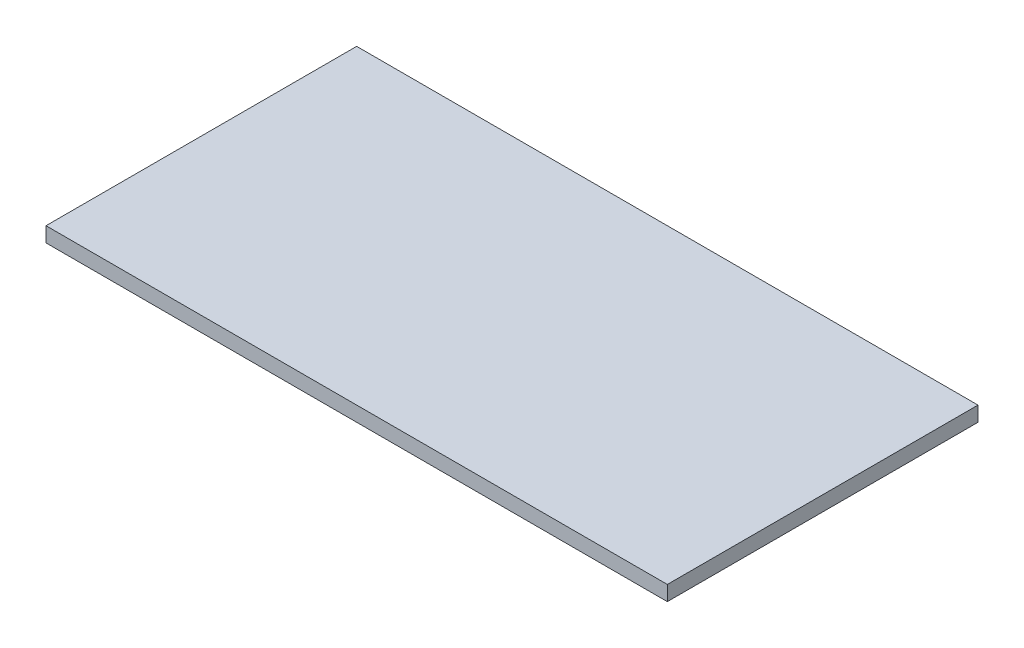
ISO-10303-21;
HEADER;
FILE_DESCRIPTION(('STEP AP214'),'2;1');
FILE_NAME('part.step','',(''),(''),'','','');
FILE_SCHEMA(('AUTOMOTIVE_DESIGN { 1 0 10303 214 1 1 1 1 }'));
ENDSEC;
DATA;
#1=APPLICATION_CONTEXT('core data for automotive mechanical design processes');
#2=APPLICATION_PROTOCOL_DEFINITION('international standard','automotive_design',2000,#1);
#3=PRODUCT_CONTEXT('',#1,'mechanical');
#4=PRODUCT('Part','Part','',(#3));
#5=PRODUCT_RELATED_PRODUCT_CATEGORY('part','',(#4));
#6=PRODUCT_DEFINITION_FORMATION('','',#4);
#7=PRODUCT_DEFINITION_CONTEXT('part definition',#1,'design');
#8=PRODUCT_DEFINITION('design','',#6,#7);
#9=PRODUCT_DEFINITION_SHAPE('','',#8);
#10=(LENGTH_UNIT() NAMED_UNIT(*) SI_UNIT(.MILLI.,.METRE.));
#11=(NAMED_UNIT(*) PLANE_ANGLE_UNIT() SI_UNIT($,.RADIAN.));
#12=(NAMED_UNIT(*) SI_UNIT($,.STERADIAN.) SOLID_ANGLE_UNIT());
#13=UNCERTAINTY_MEASURE_WITH_UNIT(LENGTH_MEASURE(1.E-05),#10,'distance_accuracy_value','');
#14=(GEOMETRIC_REPRESENTATION_CONTEXT(3) GLOBAL_UNCERTAINTY_ASSIGNED_CONTEXT((#13)) GLOBAL_UNIT_ASSIGNED_CONTEXT((#10,
#11,#12)) REPRESENTATION_CONTEXT('',''));
#15=CARTESIAN_POINT('',(0.,0.,0.));
#16=DIRECTION('',(0.,0.,1.));
#17=DIRECTION('',(1.,0.,0.));
#18=AXIS2_PLACEMENT_3D('',#15,#16,#17);
#19=CARTESIAN_POINT('',(50.,2.4,25.));
#20=DIRECTION('',(-1.,0.,0.));
#21=DIRECTION('',(0.,0.,1.));
#22=AXIS2_PLACEMENT_3D('',#19,#20,#21);
#23=PLANE('',#22);
#24=DIRECTION('',(0.,0.,-1.));
#25=VECTOR('',#24,1.);
#26=CARTESIAN_POINT('',(50.,0.,25.));
#27=LINE('',#26,#25);
#28=CARTESIAN_POINT('',(50.,0.,25.));
#29=VERTEX_POINT('',#28);
#30=CARTESIAN_POINT('',(50.,0.,-25.));
#31=VERTEX_POINT('',#30);
#32=EDGE_CURVE('E95',#29,#31,#27,.T.);
#33=ORIENTED_EDGE('',*,*,#32,.T.);
#34=DIRECTION('',(0.,-1.,0.));
#35=VECTOR('',#34,1.);
#36=CARTESIAN_POINT('',(50.,2.4,-25.));
#37=LINE('',#36,#35);
#38=CARTESIAN_POINT('',(50.,2.4,-25.));
#39=VERTEX_POINT('',#38);
#40=EDGE_CURVE('E11',#39,#31,#37,.T.);
#41=ORIENTED_EDGE('',*,*,#40,.F.);
#42=DIRECTION('',(0.,0.,-1.));
#43=VECTOR('',#42,1.);
#44=CARTESIAN_POINT('',(50.,2.4,25.));
#45=LINE('',#44,#43);
#46=CARTESIAN_POINT('',(50.,2.4,25.));
#47=VERTEX_POINT('',#46);
#48=EDGE_CURVE('E83',#47,#39,#45,.T.);
#49=ORIENTED_EDGE('',*,*,#48,.F.);
#50=DIRECTION('',(0.,-1.,0.));
#51=VECTOR('',#50,1.);
#52=CARTESIAN_POINT('',(50.,2.4,25.));
#53=LINE('',#52,#51);
#54=EDGE_CURVE('E91',#47,#29,#53,.T.);
#55=ORIENTED_EDGE('',*,*,#54,.T.);
#56=EDGE_LOOP('',(#33,#41,#49,#55));
#57=FACE_BOUND('',#56,.T.);
#58=ADVANCED_FACE('F32',(#57),#23,.F.);
#59=CARTESIAN_POINT('',(-50.,2.4,-25.));
#60=DIRECTION('',(0.,0.,1.));
#61=DIRECTION('',(1.,0.,0.));
#62=AXIS2_PLACEMENT_3D('',#59,#60,#61);
#63=PLANE('',#62);
#64=DIRECTION('',(-1.,0.,0.));
#65=VECTOR('',#64,1.);
#66=CARTESIAN_POINT('',(-50.,0.,-25.));
#67=LINE('',#66,#65);
#68=CARTESIAN_POINT('',(-50.,0.,-25.));
#69=VERTEX_POINT('',#68);
#70=EDGE_CURVE('E87',#31,#69,#67,.T.);
#71=ORIENTED_EDGE('',*,*,#70,.T.);
#72=DIRECTION('',(0.,-1.,0.));
#73=VECTOR('',#72,1.);
#74=CARTESIAN_POINT('',(-50.,2.4,-25.));
#75=LINE('',#74,#73);
#76=CARTESIAN_POINT('',(-50.,2.4,-25.));
#77=VERTEX_POINT('',#76);
#78=EDGE_CURVE('E40',#77,#69,#75,.T.);
#79=ORIENTED_EDGE('',*,*,#78,.F.);
#80=DIRECTION('',(-1.,0.,0.));
#81=VECTOR('',#80,1.);
#82=CARTESIAN_POINT('',(-50.,2.4,-25.));
#83=LINE('',#82,#81);
#84=EDGE_CURVE('E78',#39,#77,#83,.T.);
#85=ORIENTED_EDGE('',*,*,#84,.F.);
#86=ORIENTED_EDGE('',*,*,#40,.T.);
#87=EDGE_LOOP('',(#71,#79,#85,#86));
#88=FACE_BOUND('',#87,.T.);
#89=ADVANCED_FACE('F86',(#88),#63,.F.);
#90=CARTESIAN_POINT('',(-50.,2.4,25.));
#91=DIRECTION('',(1.,0.,0.));
#92=DIRECTION('',(0.,0.,-1.));
#93=AXIS2_PLACEMENT_3D('',#90,#91,#92);
#94=PLANE('',#93);
#95=DIRECTION('',(0.,0.,1.));
#96=VECTOR('',#95,1.);
#97=CARTESIAN_POINT('',(-50.,0.,25.));
#98=LINE('',#97,#96);
#99=CARTESIAN_POINT('',(-50.,0.,25.));
#100=VERTEX_POINT('',#99);
#101=EDGE_CURVE('E65',#69,#100,#98,.T.);
#102=ORIENTED_EDGE('',*,*,#101,.T.);
#103=DIRECTION('',(0.,-1.,0.));
#104=VECTOR('',#103,1.);
#105=CARTESIAN_POINT('',(-50.,2.4,25.));
#106=LINE('',#105,#104);
#107=CARTESIAN_POINT('',(-50.,2.4,25.));
#108=VERTEX_POINT('',#107);
#109=EDGE_CURVE('E88',#108,#100,#106,.T.);
#110=ORIENTED_EDGE('',*,*,#109,.F.);
#111=DIRECTION('',(0.,0.,1.));
#112=VECTOR('',#111,1.);
#113=CARTESIAN_POINT('',(-50.,2.4,25.));
#114=LINE('',#113,#112);
#115=EDGE_CURVE('E81',#77,#108,#114,.T.);
#116=ORIENTED_EDGE('',*,*,#115,.F.);
#117=ORIENTED_EDGE('',*,*,#78,.T.);
#118=EDGE_LOOP('',(#102,#110,#116,#117));
#119=FACE_BOUND('',#118,.T.);
#120=ADVANCED_FACE('F89',(#119),#94,.F.);
#121=CARTESIAN_POINT('',(-50.,2.4,25.));
#122=DIRECTION('',(0.,0.,-1.));
#123=DIRECTION('',(-1.,0.,0.));
#124=AXIS2_PLACEMENT_3D('',#121,#122,#123);
#125=PLANE('',#124);
#126=DIRECTION('',(1.,0.,0.));
#127=VECTOR('',#126,1.);
#128=CARTESIAN_POINT('',(-50.,0.,25.));
#129=LINE('',#128,#127);
#130=EDGE_CURVE('E71',#100,#29,#129,.T.);
#131=ORIENTED_EDGE('',*,*,#130,.T.);
#132=ORIENTED_EDGE('',*,*,#54,.F.);
#133=DIRECTION('',(1.,0.,0.));
#134=VECTOR('',#133,1.);
#135=CARTESIAN_POINT('',(-50.,2.4,25.));
#136=LINE('',#135,#134);
#137=EDGE_CURVE('E48',#108,#47,#136,.T.);
#138=ORIENTED_EDGE('',*,*,#137,.F.);
#139=ORIENTED_EDGE('',*,*,#109,.T.);
#140=EDGE_LOOP('',(#131,#132,#138,#139));
#141=FACE_BOUND('',#140,.T.);
#142=ADVANCED_FACE('F102',(#141),#125,.F.);
#143=CARTESIAN_POINT('',(50.,2.4,-25.));
#144=DIRECTION('',(0.,-1.,0.));
#145=DIRECTION('',(0.,0.,-1.));
#146=AXIS2_PLACEMENT_3D('',#143,#144,#145);
#147=PLANE('',#146);
#148=ORIENTED_EDGE('',*,*,#48,.T.);
#149=ORIENTED_EDGE('',*,*,#84,.T.);
#150=ORIENTED_EDGE('',*,*,#115,.T.);
#151=ORIENTED_EDGE('',*,*,#137,.T.);
#152=EDGE_LOOP('',(#148,#149,#150,#151));
#153=FACE_BOUND('',#152,.T.);
#154=ADVANCED_FACE('F79',(#153),#147,.F.);
#155=CARTESIAN_POINT('',(50.,0.,-25.));
#156=DIRECTION('',(0.,-1.,0.));
#157=DIRECTION('',(0.,0.,-1.));
#158=AXIS2_PLACEMENT_3D('',#155,#156,#157);
#159=PLANE('',#158);
#160=ORIENTED_EDGE('',*,*,#32,.F.);
#161=ORIENTED_EDGE('',*,*,#130,.F.);
#162=ORIENTED_EDGE('',*,*,#101,.F.);
#163=ORIENTED_EDGE('',*,*,#70,.F.);
#164=EDGE_LOOP('',(#160,#161,#162,#163));
#165=FACE_BOUND('',#164,.T.);
#166=ADVANCED_FACE('F105',(#165),#159,.T.);
#167=CLOSED_SHELL('',(#58,#89,#120,#142,#154,#166));
#168=MANIFOLD_SOLID_BREP('B2',#167);
#169=ADVANCED_BREP_SHAPE_REPRESENTATION('',(#18,#168),#14);
#170=SHAPE_DEFINITION_REPRESENTATION(#9,#169);
ENDSEC;
END-ISO-10303-21;
